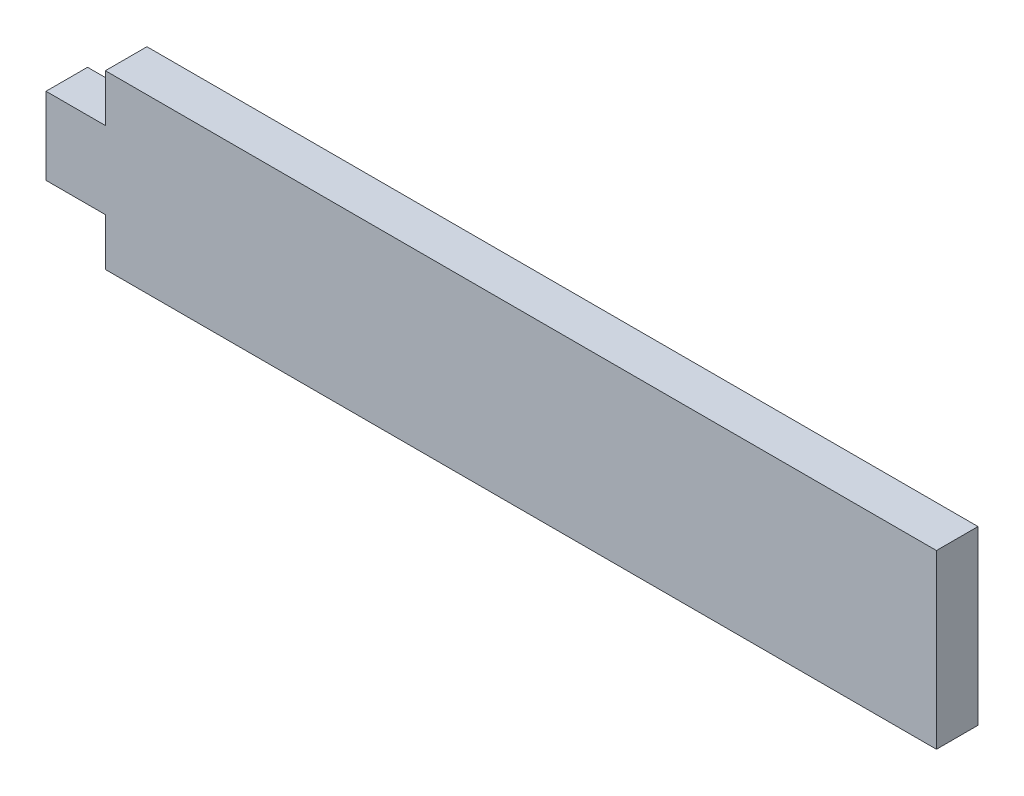
ISO-10303-21;
HEADER;
FILE_DESCRIPTION(('STEP AP214'),'2;1');
FILE_NAME('part.step','',(''),(''),'','','');
FILE_SCHEMA(('AUTOMOTIVE_DESIGN { 1 0 10303 214 1 1 1 1 }'));
ENDSEC;
DATA;
#1=APPLICATION_CONTEXT('core data for automotive mechanical design processes');
#2=APPLICATION_PROTOCOL_DEFINITION('international standard','automotive_design',2000,#1);
#3=PRODUCT_CONTEXT('',#1,'mechanical');
#4=PRODUCT('Part','Part','',(#3));
#5=PRODUCT_RELATED_PRODUCT_CATEGORY('part','',(#4));
#6=PRODUCT_DEFINITION_FORMATION('','',#4);
#7=PRODUCT_DEFINITION_CONTEXT('part definition',#1,'design');
#8=PRODUCT_DEFINITION('design','',#6,#7);
#9=PRODUCT_DEFINITION_SHAPE('','',#8);
#10=(LENGTH_UNIT() NAMED_UNIT(*) SI_UNIT(.MILLI.,.METRE.));
#11=(NAMED_UNIT(*) PLANE_ANGLE_UNIT() SI_UNIT($,.RADIAN.));
#12=(NAMED_UNIT(*) SI_UNIT($,.STERADIAN.) SOLID_ANGLE_UNIT());
#13=UNCERTAINTY_MEASURE_WITH_UNIT(LENGTH_MEASURE(1.E-05),#10,'distance_accuracy_value','');
#14=(GEOMETRIC_REPRESENTATION_CONTEXT(3) GLOBAL_UNCERTAINTY_ASSIGNED_CONTEXT((#13)) GLOBAL_UNIT_ASSIGNED_CONTEXT((#10,
#11,#12)) REPRESENTATION_CONTEXT('',''));
#15=CARTESIAN_POINT('',(0.,0.,0.));
#16=DIRECTION('',(0.,0.,1.));
#17=DIRECTION('',(1.,0.,0.));
#18=AXIS2_PLACEMENT_3D('',#15,#16,#17);
#19=CARTESIAN_POINT('',(-49.9999999999998,0.,0.));
#20=DIRECTION('',(-1.,0.,0.));
#21=DIRECTION('',(0.,0.,1.));
#22=AXIS2_PLACEMENT_3D('',#19,#20,#21);
#23=PLANE('',#22);
#24=DIRECTION('',(0.,0.,-1.));
#25=VECTOR('',#24,1.);
#26=CARTESIAN_POINT('',(-49.9999999999998,32.4999999999999,0.));
#27=LINE('',#26,#25);
#28=CARTESIAN_POINT('',(-49.9999999999998,32.4999999999999,35.));
#29=VERTEX_POINT('',#28);
#30=CARTESIAN_POINT('',(-49.9999999999998,32.4999999999999,0.));
#31=VERTEX_POINT('',#30);
#32=EDGE_CURVE('E50',#29,#31,#27,.T.);
#33=ORIENTED_EDGE('',*,*,#32,.F.);
#34=DIRECTION('',(0.,1.,0.));
#35=VECTOR('',#34,1.);
#36=CARTESIAN_POINT('',(-49.9999999999998,72.5,35.));
#37=LINE('',#36,#35);
#38=CARTESIAN_POINT('',(-49.9999999999998,72.5,35.));
#39=VERTEX_POINT('',#38);
#40=EDGE_CURVE('E132',#29,#39,#37,.T.);
#41=ORIENTED_EDGE('',*,*,#40,.T.);
#42=DIRECTION('',(0.,0.,-1.));
#43=VECTOR('',#42,1.);
#44=CARTESIAN_POINT('',(-49.9999999999998,72.5,0.));
#45=LINE('',#44,#43);
#46=CARTESIAN_POINT('',(-49.9999999999998,72.5,0.));
#47=VERTEX_POINT('',#46);
#48=EDGE_CURVE('E135',#39,#47,#45,.T.);
#49=ORIENTED_EDGE('',*,*,#48,.T.);
#50=DIRECTION('',(0.,-1.,0.));
#51=VECTOR('',#50,1.);
#52=CARTESIAN_POINT('',(-49.9999999999998,72.5,0.));
#53=LINE('',#52,#51);
#54=EDGE_CURVE('E124',#47,#31,#53,.T.);
#55=ORIENTED_EDGE('',*,*,#54,.T.);
#56=EDGE_LOOP('',(#33,#41,#49,#55));
#57=FACE_BOUND('',#56,.T.);
#58=ADVANCED_FACE('F35',(#57),#23,.T.);
#59=CARTESIAN_POINT('',(-650.,72.5,35.));
#60=DIRECTION('',(0.,-1.,0.));
#61=DIRECTION('',(0.,0.,-1.));
#62=AXIS2_PLACEMENT_3D('',#59,#60,#61);
#63=PLANE('',#62);
#64=ORIENTED_EDGE('',*,*,#48,.F.);
#65=DIRECTION('',(-1.,0.,0.));
#66=VECTOR('',#65,1.);
#67=CARTESIAN_POINT('',(-650.,72.5,35.));
#68=LINE('',#67,#66);
#69=CARTESIAN_POINT('',(650.,72.5,35.));
#70=VERTEX_POINT('',#69);
#71=EDGE_CURVE('E141',#70,#39,#68,.T.);
#72=ORIENTED_EDGE('',*,*,#71,.F.);
#73=DIRECTION('',(0.,0.,-1.));
#74=VECTOR('',#73,1.);
#75=CARTESIAN_POINT('',(650.,72.5,35.));
#76=LINE('',#75,#74);
#77=CARTESIAN_POINT('',(650.,72.5,0.));
#78=VERTEX_POINT('',#77);
#79=EDGE_CURVE('E11',#70,#78,#76,.T.);
#80=ORIENTED_EDGE('',*,*,#79,.T.);
#81=DIRECTION('',(-1.,0.,0.));
#82=VECTOR('',#81,1.);
#83=CARTESIAN_POINT('',(-650.,72.5,0.));
#84=LINE('',#83,#82);
#85=EDGE_CURVE('E149',#78,#47,#84,.T.);
#86=ORIENTED_EDGE('',*,*,#85,.T.);
#87=EDGE_LOOP('',(#64,#72,#80,#86));
#88=FACE_BOUND('',#87,.T.);
#89=ADVANCED_FACE('F163',(#88),#63,.F.);
#90=CARTESIAN_POINT('',(-650.,-72.5,35.));
#91=DIRECTION('',(0.,1.,0.));
#92=DIRECTION('',(0.,0.,1.));
#93=AXIS2_PLACEMENT_3D('',#90,#91,#92);
#94=PLANE('',#93);
#95=DIRECTION('',(0.,0.,1.));
#96=VECTOR('',#95,1.);
#97=CARTESIAN_POINT('',(-49.9999999999998,-72.5,0.));
#98=LINE('',#97,#96);
#99=CARTESIAN_POINT('',(-49.9999999999998,-72.5,0.));
#100=VERTEX_POINT('',#99);
#101=CARTESIAN_POINT('',(-49.9999999999998,-72.5,35.));
#102=VERTEX_POINT('',#101);
#103=EDGE_CURVE('E130',#100,#102,#98,.T.);
#104=ORIENTED_EDGE('',*,*,#103,.F.);
#105=DIRECTION('',(1.,0.,0.));
#106=VECTOR('',#105,1.);
#107=CARTESIAN_POINT('',(-650.,-72.5,0.));
#108=LINE('',#107,#106);
#109=CARTESIAN_POINT('',(650.,-72.5,0.));
#110=VERTEX_POINT('',#109);
#111=EDGE_CURVE('E142',#100,#110,#108,.T.);
#112=ORIENTED_EDGE('',*,*,#111,.T.);
#113=DIRECTION('',(0.,0.,-1.));
#114=VECTOR('',#113,1.);
#115=CARTESIAN_POINT('',(650.,-72.5,35.));
#116=LINE('',#115,#114);
#117=CARTESIAN_POINT('',(650.,-72.5,35.));
#118=VERTEX_POINT('',#117);
#119=EDGE_CURVE('E43',#118,#110,#116,.T.);
#120=ORIENTED_EDGE('',*,*,#119,.F.);
#121=DIRECTION('',(1.,0.,0.));
#122=VECTOR('',#121,1.);
#123=CARTESIAN_POINT('',(-650.,-72.5,35.));
#124=LINE('',#123,#122);
#125=EDGE_CURVE('E145',#102,#118,#124,.T.);
#126=ORIENTED_EDGE('',*,*,#125,.F.);
#127=EDGE_LOOP('',(#104,#112,#120,#126));
#128=FACE_BOUND('',#127,.T.);
#129=ADVANCED_FACE('F168',(#128),#94,.F.);
#130=CARTESIAN_POINT('',(0.,0.,35.));
#131=DIRECTION('',(0.,0.,-1.));
#132=DIRECTION('',(-1.,0.,0.));
#133=AXIS2_PLACEMENT_3D('',#130,#131,#132);
#134=PLANE('',#133);
#135=CARTESIAN_POINT('',(-49.9999999999998,-32.4999999999996,35.));
#136=VERTEX_POINT('',#135);
#137=EDGE_CURVE('E133',#102,#136,#37,.T.);
#138=ORIENTED_EDGE('',*,*,#137,.F.);
#139=ORIENTED_EDGE('',*,*,#125,.T.);
#140=DIRECTION('',(0.,1.,0.));
#141=VECTOR('',#140,1.);
#142=CARTESIAN_POINT('',(650.,-72.5,35.));
#143=LINE('',#142,#141);
#144=EDGE_CURVE('E138',#118,#70,#143,.T.);
#145=ORIENTED_EDGE('',*,*,#144,.T.);
#146=ORIENTED_EDGE('',*,*,#71,.T.);
#147=ORIENTED_EDGE('',*,*,#40,.F.);
#148=DIRECTION('',(1.,0.,0.));
#149=VECTOR('',#148,1.);
#150=CARTESIAN_POINT('',(-99.9999999999998,32.4999999999999,35.));
#151=LINE('',#150,#149);
#152=CARTESIAN_POINT('',(-99.9999999999998,32.4999999999999,35.));
#153=VERTEX_POINT('',#152);
#154=EDGE_CURVE('E126',#153,#29,#151,.T.);
#155=ORIENTED_EDGE('',*,*,#154,.F.);
#156=DIRECTION('',(0.,1.,0.));
#157=VECTOR('',#156,1.);
#158=CARTESIAN_POINT('',(-99.9999999999998,32.4999999999999,35.));
#159=LINE('',#158,#157);
#160=CARTESIAN_POINT('',(-99.9999999999998,-32.4999999999996,35.));
#161=VERTEX_POINT('',#160);
#162=EDGE_CURVE('E109',#161,#153,#159,.T.);
#163=ORIENTED_EDGE('',*,*,#162,.F.);
#164=DIRECTION('',(1.,0.,0.));
#165=VECTOR('',#164,1.);
#166=CARTESIAN_POINT('',(-99.9999999999998,-32.4999999999996,35.));
#167=LINE('',#166,#165);
#168=EDGE_CURVE('E106',#161,#136,#167,.T.);
#169=ORIENTED_EDGE('',*,*,#168,.T.);
#170=EDGE_LOOP('',(#138,#139,#145,#146,#147,#155,#163,#169));
#171=FACE_BOUND('',#170,.T.);
#172=ADVANCED_FACE('F166',(#171),#134,.F.);
#173=CARTESIAN_POINT('',(0.,0.,0.));
#174=DIRECTION('',(0.,0.,-1.));
#175=DIRECTION('',(-1.,0.,0.));
#176=AXIS2_PLACEMENT_3D('',#173,#174,#175);
#177=PLANE('',#176);
#178=ORIENTED_EDGE('',*,*,#111,.F.);
#179=CARTESIAN_POINT('',(-49.9999999999998,-32.4999999999996,0.));
#180=VERTEX_POINT('',#179);
#181=EDGE_CURVE('E122',#180,#100,#53,.T.);
#182=ORIENTED_EDGE('',*,*,#181,.F.);
#183=DIRECTION('',(1.,0.,0.));
#184=VECTOR('',#183,1.);
#185=CARTESIAN_POINT('',(-99.9999999999998,-32.4999999999996,0.));
#186=LINE('',#185,#184);
#187=CARTESIAN_POINT('',(-99.9999999999998,-32.4999999999996,0.));
#188=VERTEX_POINT('',#187);
#189=EDGE_CURVE('E104',#188,#180,#186,.T.);
#190=ORIENTED_EDGE('',*,*,#189,.F.);
#191=DIRECTION('',(0.,-1.,0.));
#192=VECTOR('',#191,1.);
#193=CARTESIAN_POINT('',(-99.9999999999998,32.4999999999999,0.));
#194=LINE('',#193,#192);
#195=CARTESIAN_POINT('',(-99.9999999999998,32.4999999999999,0.));
#196=VERTEX_POINT('',#195);
#197=EDGE_CURVE('E110',#196,#188,#194,.T.);
#198=ORIENTED_EDGE('',*,*,#197,.F.);
#199=DIRECTION('',(1.,0.,0.));
#200=VECTOR('',#199,1.);
#201=CARTESIAN_POINT('',(-99.9999999999998,32.4999999999999,0.));
#202=LINE('',#201,#200);
#203=EDGE_CURVE('E174',#196,#31,#202,.T.);
#204=ORIENTED_EDGE('',*,*,#203,.T.);
#205=ORIENTED_EDGE('',*,*,#54,.F.);
#206=ORIENTED_EDGE('',*,*,#85,.F.);
#207=DIRECTION('',(0.,1.,0.));
#208=VECTOR('',#207,1.);
#209=CARTESIAN_POINT('',(650.,-72.5,0.));
#210=LINE('',#209,#208);
#211=EDGE_CURVE('E137',#110,#78,#210,.T.);
#212=ORIENTED_EDGE('',*,*,#211,.F.);
#213=EDGE_LOOP('',(#178,#182,#190,#198,#204,#205,#206,#212));
#214=FACE_BOUND('',#213,.T.);
#215=ADVANCED_FACE('F121',(#214),#177,.T.);
#216=CARTESIAN_POINT('',(650.,-72.5,35.));
#217=DIRECTION('',(-1.,0.,0.));
#218=DIRECTION('',(0.,0.,1.));
#219=AXIS2_PLACEMENT_3D('',#216,#217,#218);
#220=PLANE('',#219);
#221=ORIENTED_EDGE('',*,*,#211,.T.);
#222=ORIENTED_EDGE('',*,*,#79,.F.);
#223=ORIENTED_EDGE('',*,*,#144,.F.);
#224=ORIENTED_EDGE('',*,*,#119,.T.);
#225=EDGE_LOOP('',(#221,#222,#223,#224));
#226=FACE_BOUND('',#225,.T.);
#227=ADVANCED_FACE('F37',(#226),#220,.F.);
#228=DIRECTION('',(0.,0.,1.));
#229=VECTOR('',#228,1.);
#230=CARTESIAN_POINT('',(-49.9999999999998,-32.4999999999996,0.));
#231=LINE('',#230,#229);
#232=EDGE_CURVE('E58',#180,#136,#231,.T.);
#233=ORIENTED_EDGE('',*,*,#232,.F.);
#234=ORIENTED_EDGE('',*,*,#181,.T.);
#235=ORIENTED_EDGE('',*,*,#103,.T.);
#236=ORIENTED_EDGE('',*,*,#137,.T.);
#237=EDGE_LOOP('',(#233,#234,#235,#236));
#238=FACE_BOUND('',#237,.T.);
#239=ADVANCED_FACE('F169',(#238),#23,.T.);
#240=CARTESIAN_POINT('',(-99.9999999999998,-32.4999999999996,0.));
#241=DIRECTION('',(0.,1.,0.));
#242=DIRECTION('',(0.,0.,1.));
#243=AXIS2_PLACEMENT_3D('',#240,#241,#242);
#244=PLANE('',#243);
#245=ORIENTED_EDGE('',*,*,#232,.T.);
#246=ORIENTED_EDGE('',*,*,#168,.F.);
#247=DIRECTION('',(0.,0.,1.));
#248=VECTOR('',#247,1.);
#249=CARTESIAN_POINT('',(-99.9999999999998,-32.4999999999996,0.));
#250=LINE('',#249,#248);
#251=EDGE_CURVE('E100',#188,#161,#250,.T.);
#252=ORIENTED_EDGE('',*,*,#251,.F.);
#253=ORIENTED_EDGE('',*,*,#189,.T.);
#254=EDGE_LOOP('',(#245,#246,#252,#253));
#255=FACE_BOUND('',#254,.T.);
#256=ADVANCED_FACE('F102',(#255),#244,.F.);
#257=CARTESIAN_POINT('',(-99.9999999999998,32.4999999999999,0.));
#258=DIRECTION('',(0.,-1.,0.));
#259=DIRECTION('',(0.,0.,-1.));
#260=AXIS2_PLACEMENT_3D('',#257,#258,#259);
#261=PLANE('',#260);
#262=ORIENTED_EDGE('',*,*,#32,.T.);
#263=ORIENTED_EDGE('',*,*,#203,.F.);
#264=DIRECTION('',(0.,0.,-1.));
#265=VECTOR('',#264,1.);
#266=CARTESIAN_POINT('',(-99.9999999999998,32.4999999999999,0.));
#267=LINE('',#266,#265);
#268=EDGE_CURVE('E115',#153,#196,#267,.T.);
#269=ORIENTED_EDGE('',*,*,#268,.F.);
#270=ORIENTED_EDGE('',*,*,#154,.T.);
#271=EDGE_LOOP('',(#262,#263,#269,#270));
#272=FACE_BOUND('',#271,.T.);
#273=ADVANCED_FACE('F179',(#272),#261,.F.);
#274=CARTESIAN_POINT('',(-99.9999999999998,0.,0.));
#275=DIRECTION('',(-1.,0.,0.));
#276=DIRECTION('',(0.,0.,1.));
#277=AXIS2_PLACEMENT_3D('',#274,#275,#276);
#278=PLANE('',#277);
#279=ORIENTED_EDGE('',*,*,#197,.T.);
#280=ORIENTED_EDGE('',*,*,#251,.T.);
#281=ORIENTED_EDGE('',*,*,#162,.T.);
#282=ORIENTED_EDGE('',*,*,#268,.T.);
#283=EDGE_LOOP('',(#279,#280,#281,#282));
#284=FACE_BOUND('',#283,.T.);
#285=ADVANCED_FACE('F113',(#284),#278,.T.);
#286=CLOSED_SHELL('',(#58,#89,#129,#172,#215,#227,#239,#256,#273,#285));
#287=MANIFOLD_SOLID_BREP('B2',#286);
#288=ADVANCED_BREP_SHAPE_REPRESENTATION('',(#18,#287),#14);
#289=SHAPE_DEFINITION_REPRESENTATION(#9,#288);
ENDSEC;
END-ISO-10303-21;
